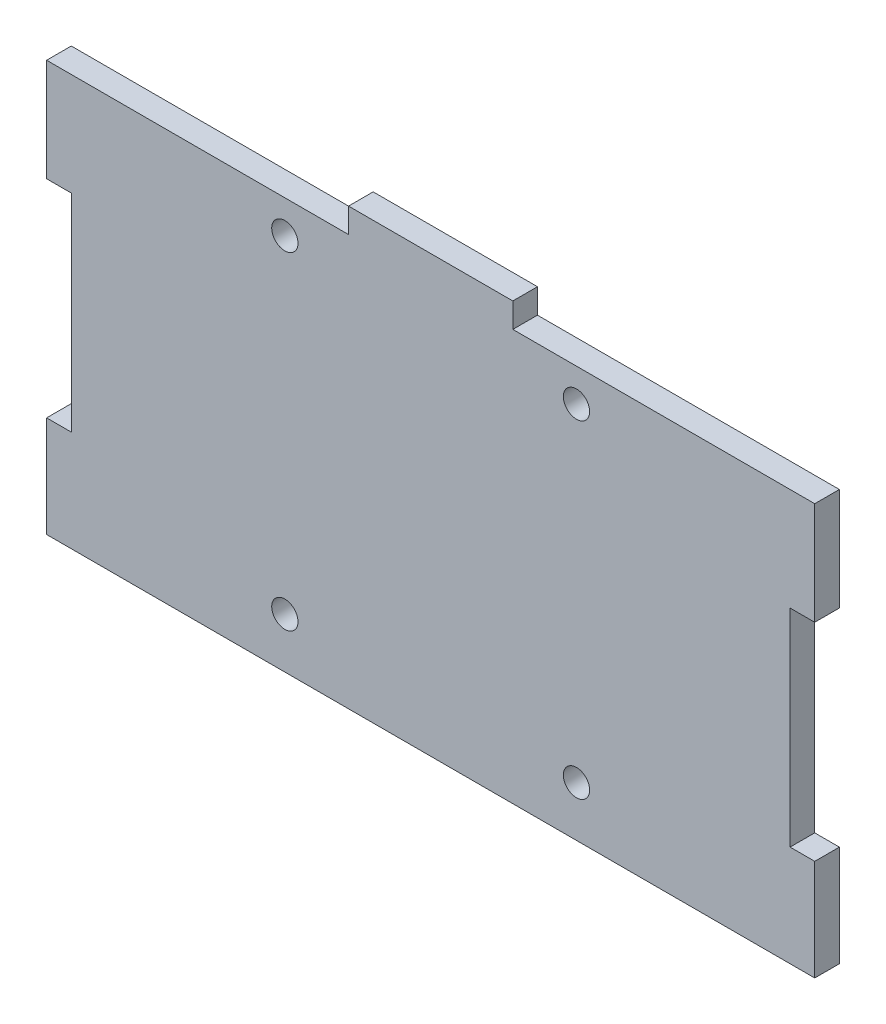
ISO-10303-21;
HEADER;
FILE_DESCRIPTION(('STEP AP214'),'2;1');
FILE_NAME('part.step','',(''),(''),'','','');
FILE_SCHEMA(('AUTOMOTIVE_DESIGN { 1 0 10303 214 1 1 1 1 }'));
ENDSEC;
DATA;
#1=APPLICATION_CONTEXT('core data for automotive mechanical design processes');
#2=APPLICATION_PROTOCOL_DEFINITION('international standard','automotive_design',2000,#1);
#3=PRODUCT_CONTEXT('',#1,'mechanical');
#4=PRODUCT('Part','Part','',(#3));
#5=PRODUCT_RELATED_PRODUCT_CATEGORY('part','',(#4));
#6=PRODUCT_DEFINITION_FORMATION('','',#4);
#7=PRODUCT_DEFINITION_CONTEXT('part definition',#1,'design');
#8=PRODUCT_DEFINITION('design','',#6,#7);
#9=PRODUCT_DEFINITION_SHAPE('','',#8);
#10=(LENGTH_UNIT() NAMED_UNIT(*) SI_UNIT(.MILLI.,.METRE.));
#11=(NAMED_UNIT(*) PLANE_ANGLE_UNIT() SI_UNIT($,.RADIAN.));
#12=(NAMED_UNIT(*) SI_UNIT($,.STERADIAN.) SOLID_ANGLE_UNIT());
#13=UNCERTAINTY_MEASURE_WITH_UNIT(LENGTH_MEASURE(1.E-05),#10,'distance_accuracy_value','');
#14=(GEOMETRIC_REPRESENTATION_CONTEXT(3) GLOBAL_UNCERTAINTY_ASSIGNED_CONTEXT((#13)) GLOBAL_UNIT_ASSIGNED_CONTEXT((#10,
#11,#12)) REPRESENTATION_CONTEXT('',''));
#15=CARTESIAN_POINT('',(0.,0.,0.));
#16=DIRECTION('',(0.,0.,1.));
#17=DIRECTION('',(1.,0.,0.));
#18=AXIS2_PLACEMENT_3D('',#15,#16,#17);
#19=CARTESIAN_POINT('',(-26.2,25.,3.));
#20=DIRECTION('',(0.,-1.,0.));
#21=DIRECTION('',(0.,0.,-1.));
#22=AXIS2_PLACEMENT_3D('',#19,#20,#21);
#23=PLANE('',#22);
#24=DIRECTION('',(0.,0.,1.));
#25=VECTOR('',#24,1.);
#26=CARTESIAN_POINT('',(-10.,25.,0.));
#27=LINE('',#26,#25);
#28=CARTESIAN_POINT('',(-10.,25.,0.));
#29=VERTEX_POINT('',#28);
#30=CARTESIAN_POINT('',(-10.,25.,3.));
#31=VERTEX_POINT('',#30);
#32=EDGE_CURVE('E294',#29,#31,#27,.T.);
#33=ORIENTED_EDGE('',*,*,#32,.F.);
#34=DIRECTION('',(-1.,0.,0.));
#35=VECTOR('',#34,1.);
#36=CARTESIAN_POINT('',(-26.2,25.,0.));
#37=LINE('',#36,#35);
#38=CARTESIAN_POINT('',(-46.75,25.,0.));
#39=VERTEX_POINT('',#38);
#40=EDGE_CURVE('E103',#29,#39,#37,.T.);
#41=ORIENTED_EDGE('',*,*,#40,.T.);
#42=DIRECTION('',(0.,0.,-1.));
#43=VECTOR('',#42,1.);
#44=CARTESIAN_POINT('',(-46.75,25.,3.));
#45=LINE('',#44,#43);
#46=CARTESIAN_POINT('',(-46.75,25.,3.));
#47=VERTEX_POINT('',#46);
#48=EDGE_CURVE('E171',#47,#39,#45,.T.);
#49=ORIENTED_EDGE('',*,*,#48,.F.);
#50=DIRECTION('',(-1.,0.,0.));
#51=VECTOR('',#50,1.);
#52=CARTESIAN_POINT('',(46.75,25.,3.));
#53=LINE('',#52,#51);
#54=EDGE_CURVE('E57',#31,#47,#53,.T.);
#55=ORIENTED_EDGE('',*,*,#54,.F.);
#56=EDGE_LOOP('',(#33,#41,#49,#55));
#57=FACE_BOUND('',#56,.T.);
#58=ADVANCED_FACE('F33',(#57),#23,.F.);
#59=CARTESIAN_POINT('',(-46.75,12.5,3.));
#60=DIRECTION('',(1.,0.,0.));
#61=DIRECTION('',(0.,0.,-1.));
#62=AXIS2_PLACEMENT_3D('',#59,#60,#61);
#63=PLANE('',#62);
#64=DIRECTION('',(0.,-1.,0.));
#65=VECTOR('',#64,1.);
#66=CARTESIAN_POINT('',(-46.75,12.5,0.));
#67=LINE('',#66,#65);
#68=CARTESIAN_POINT('',(-46.75,12.5,0.));
#69=VERTEX_POINT('',#68);
#70=EDGE_CURVE('E172',#39,#69,#67,.T.);
#71=ORIENTED_EDGE('',*,*,#70,.T.);
#72=DIRECTION('',(0.,0.,-1.));
#73=VECTOR('',#72,1.);
#74=CARTESIAN_POINT('',(-46.75,12.5,3.));
#75=LINE('',#74,#73);
#76=CARTESIAN_POINT('',(-46.75,12.5,3.));
#77=VERTEX_POINT('',#76);
#78=EDGE_CURVE('E11',#77,#69,#75,.T.);
#79=ORIENTED_EDGE('',*,*,#78,.F.);
#80=DIRECTION('',(0.,-1.,0.));
#81=VECTOR('',#80,1.);
#82=CARTESIAN_POINT('',(-46.75,12.5,3.));
#83=LINE('',#82,#81);
#84=EDGE_CURVE('E198',#47,#77,#83,.T.);
#85=ORIENTED_EDGE('',*,*,#84,.F.);
#86=ORIENTED_EDGE('',*,*,#48,.T.);
#87=EDGE_LOOP('',(#71,#79,#85,#86));
#88=FACE_BOUND('',#87,.T.);
#89=ADVANCED_FACE('F35',(#88),#63,.F.);
#90=CARTESIAN_POINT('',(-46.75,12.5,3.));
#91=DIRECTION('',(0.,1.,0.));
#92=DIRECTION('',(-1.,0.,0.));
#93=AXIS2_PLACEMENT_3D('',#90,#91,#92);
#94=PLANE('',#93);
#95=DIRECTION('',(1.,0.,0.));
#96=VECTOR('',#95,1.);
#97=CARTESIAN_POINT('',(-46.75,12.5,0.));
#98=LINE('',#97,#96);
#99=CARTESIAN_POINT('',(-43.75,12.5,0.));
#100=VERTEX_POINT('',#99);
#101=EDGE_CURVE('E175',#69,#100,#98,.T.);
#102=ORIENTED_EDGE('',*,*,#101,.T.);
#103=DIRECTION('',(0.,0.,-1.));
#104=VECTOR('',#103,1.);
#105=CARTESIAN_POINT('',(-43.75,12.5,3.));
#106=LINE('',#105,#104);
#107=CARTESIAN_POINT('',(-43.75,12.5,3.));
#108=VERTEX_POINT('',#107);
#109=EDGE_CURVE('E41',#108,#100,#106,.T.);
#110=ORIENTED_EDGE('',*,*,#109,.F.);
#111=DIRECTION('',(1.,0.,0.));
#112=VECTOR('',#111,1.);
#113=CARTESIAN_POINT('',(-46.75,12.5,3.));
#114=LINE('',#113,#112);
#115=EDGE_CURVE('E111',#77,#108,#114,.T.);
#116=ORIENTED_EDGE('',*,*,#115,.F.);
#117=ORIENTED_EDGE('',*,*,#78,.T.);
#118=EDGE_LOOP('',(#102,#110,#116,#117));
#119=FACE_BOUND('',#118,.T.);
#120=ADVANCED_FACE('F302',(#119),#94,.F.);
#121=CARTESIAN_POINT('',(-43.75,12.5,3.));
#122=DIRECTION('',(1.,0.,0.));
#123=DIRECTION('',(0.,0.,-1.));
#124=AXIS2_PLACEMENT_3D('',#121,#122,#123);
#125=PLANE('',#124);
#126=DIRECTION('',(0.,-1.,0.));
#127=VECTOR('',#126,1.);
#128=CARTESIAN_POINT('',(-43.75,12.5,0.));
#129=LINE('',#128,#127);
#130=CARTESIAN_POINT('',(-43.75,-12.7,0.));
#131=VERTEX_POINT('',#130);
#132=EDGE_CURVE('E178',#100,#131,#129,.T.);
#133=ORIENTED_EDGE('',*,*,#132,.T.);
#134=DIRECTION('',(0.,0.,-1.));
#135=VECTOR('',#134,1.);
#136=CARTESIAN_POINT('',(-43.75,-12.7,3.));
#137=LINE('',#136,#135);
#138=CARTESIAN_POINT('',(-43.75,-12.7,3.));
#139=VERTEX_POINT('',#138);
#140=EDGE_CURVE('E217',#139,#131,#137,.T.);
#141=ORIENTED_EDGE('',*,*,#140,.F.);
#142=DIRECTION('',(0.,-1.,0.));
#143=VECTOR('',#142,1.);
#144=CARTESIAN_POINT('',(-43.75,12.5,3.));
#145=LINE('',#144,#143);
#146=EDGE_CURVE('E225',#108,#139,#145,.T.);
#147=ORIENTED_EDGE('',*,*,#146,.F.);
#148=ORIENTED_EDGE('',*,*,#109,.T.);
#149=EDGE_LOOP('',(#133,#141,#147,#148));
#150=FACE_BOUND('',#149,.T.);
#151=ADVANCED_FACE('F223',(#150),#125,.F.);
#152=CARTESIAN_POINT('',(-46.75,-12.7,3.));
#153=DIRECTION('',(0.,-1.,0.));
#154=DIRECTION('',(1.,0.,0.));
#155=AXIS2_PLACEMENT_3D('',#152,#153,#154);
#156=PLANE('',#155);
#157=DIRECTION('',(-1.,0.,0.));
#158=VECTOR('',#157,1.);
#159=CARTESIAN_POINT('',(-46.75,-12.7,0.));
#160=LINE('',#159,#158);
#161=CARTESIAN_POINT('',(-46.75,-12.7,0.));
#162=VERTEX_POINT('',#161);
#163=EDGE_CURVE('E180',#131,#162,#160,.T.);
#164=ORIENTED_EDGE('',*,*,#163,.T.);
#165=DIRECTION('',(0.,0.,-1.));
#166=VECTOR('',#165,1.);
#167=CARTESIAN_POINT('',(-46.75,-12.7,3.));
#168=LINE('',#167,#166);
#169=CARTESIAN_POINT('',(-46.75,-12.7,3.));
#170=VERTEX_POINT('',#169);
#171=EDGE_CURVE('E214',#170,#162,#168,.T.);
#172=ORIENTED_EDGE('',*,*,#171,.F.);
#173=DIRECTION('',(-1.,0.,0.));
#174=VECTOR('',#173,1.);
#175=CARTESIAN_POINT('',(-46.75,-12.7,3.));
#176=LINE('',#175,#174);
#177=EDGE_CURVE('E243',#139,#170,#176,.T.);
#178=ORIENTED_EDGE('',*,*,#177,.F.);
#179=ORIENTED_EDGE('',*,*,#140,.T.);
#180=EDGE_LOOP('',(#164,#172,#178,#179));
#181=FACE_BOUND('',#180,.T.);
#182=ADVANCED_FACE('F234',(#181),#156,.F.);
#183=CARTESIAN_POINT('',(-46.75,-25.,3.));
#184=DIRECTION('',(1.,0.,0.));
#185=DIRECTION('',(0.,1.,0.));
#186=AXIS2_PLACEMENT_3D('',#183,#184,#185);
#187=PLANE('',#186);
#188=DIRECTION('',(0.,-1.,0.));
#189=VECTOR('',#188,1.);
#190=CARTESIAN_POINT('',(-46.75,-25.,0.));
#191=LINE('',#190,#189);
#192=CARTESIAN_POINT('',(-46.75,-25.,0.));
#193=VERTEX_POINT('',#192);
#194=EDGE_CURVE('E182',#162,#193,#191,.T.);
#195=ORIENTED_EDGE('',*,*,#194,.T.);
#196=DIRECTION('',(0.,0.,-1.));
#197=VECTOR('',#196,1.);
#198=CARTESIAN_POINT('',(-46.75,-25.,3.));
#199=LINE('',#198,#197);
#200=CARTESIAN_POINT('',(-46.75,-25.,3.));
#201=VERTEX_POINT('',#200);
#202=EDGE_CURVE('E211',#201,#193,#199,.T.);
#203=ORIENTED_EDGE('',*,*,#202,.F.);
#204=DIRECTION('',(0.,-1.,0.));
#205=VECTOR('',#204,1.);
#206=CARTESIAN_POINT('',(-46.75,-25.,3.));
#207=LINE('',#206,#205);
#208=EDGE_CURVE('E240',#170,#201,#207,.T.);
#209=ORIENTED_EDGE('',*,*,#208,.F.);
#210=ORIENTED_EDGE('',*,*,#171,.T.);
#211=EDGE_LOOP('',(#195,#203,#209,#210));
#212=FACE_BOUND('',#211,.T.);
#213=ADVANCED_FACE('F238',(#212),#187,.F.);
#214=CARTESIAN_POINT('',(46.75,-25.,3.));
#215=DIRECTION('',(0.,1.,0.));
#216=DIRECTION('',(-1.,0.,0.));
#217=AXIS2_PLACEMENT_3D('',#214,#215,#216);
#218=PLANE('',#217);
#219=DIRECTION('',(1.,0.,0.));
#220=VECTOR('',#219,1.);
#221=CARTESIAN_POINT('',(46.75,-25.,0.));
#222=LINE('',#221,#220);
#223=CARTESIAN_POINT('',(46.75,-25.,0.));
#224=VERTEX_POINT('',#223);
#225=EDGE_CURVE('E184',#193,#224,#222,.T.);
#226=ORIENTED_EDGE('',*,*,#225,.T.);
#227=DIRECTION('',(0.,0.,-1.));
#228=VECTOR('',#227,1.);
#229=CARTESIAN_POINT('',(46.75,-25.,3.));
#230=LINE('',#229,#228);
#231=CARTESIAN_POINT('',(46.75,-25.,3.));
#232=VERTEX_POINT('',#231);
#233=EDGE_CURVE('E208',#232,#224,#230,.T.);
#234=ORIENTED_EDGE('',*,*,#233,.F.);
#235=DIRECTION('',(1.,0.,0.));
#236=VECTOR('',#235,1.);
#237=CARTESIAN_POINT('',(46.75,-25.,3.));
#238=LINE('',#237,#236);
#239=EDGE_CURVE('E242',#201,#232,#238,.T.);
#240=ORIENTED_EDGE('',*,*,#239,.F.);
#241=ORIENTED_EDGE('',*,*,#202,.T.);
#242=EDGE_LOOP('',(#226,#234,#240,#241));
#243=FACE_BOUND('',#242,.T.);
#244=ADVANCED_FACE('F334',(#243),#218,.F.);
#245=CARTESIAN_POINT('',(46.75,-25.,3.));
#246=DIRECTION('',(-1.,0.,0.));
#247=DIRECTION('',(0.,-1.,0.));
#248=AXIS2_PLACEMENT_3D('',#245,#246,#247);
#249=PLANE('',#248);
#250=DIRECTION('',(0.,1.,0.));
#251=VECTOR('',#250,1.);
#252=CARTESIAN_POINT('',(46.75,-25.,0.));
#253=LINE('',#252,#251);
#254=CARTESIAN_POINT('',(46.75,-12.7,0.));
#255=VERTEX_POINT('',#254);
#256=EDGE_CURVE('E186',#224,#255,#253,.T.);
#257=ORIENTED_EDGE('',*,*,#256,.T.);
#258=DIRECTION('',(0.,0.,-1.));
#259=VECTOR('',#258,1.);
#260=CARTESIAN_POINT('',(46.75,-12.7,3.));
#261=LINE('',#260,#259);
#262=CARTESIAN_POINT('',(46.75,-12.7,3.));
#263=VERTEX_POINT('',#262);
#264=EDGE_CURVE('E205',#263,#255,#261,.T.);
#265=ORIENTED_EDGE('',*,*,#264,.F.);
#266=DIRECTION('',(0.,1.,0.));
#267=VECTOR('',#266,1.);
#268=CARTESIAN_POINT('',(46.75,-25.,3.));
#269=LINE('',#268,#267);
#270=EDGE_CURVE('E245',#232,#263,#269,.T.);
#271=ORIENTED_EDGE('',*,*,#270,.F.);
#272=ORIENTED_EDGE('',*,*,#233,.T.);
#273=EDGE_LOOP('',(#257,#265,#271,#272));
#274=FACE_BOUND('',#273,.T.);
#275=ADVANCED_FACE('F331',(#274),#249,.F.);
#276=CARTESIAN_POINT('',(46.75,-12.7,3.));
#277=DIRECTION('',(0.,-1.,0.));
#278=DIRECTION('',(0.,0.,-1.));
#279=AXIS2_PLACEMENT_3D('',#276,#277,#278);
#280=PLANE('',#279);
#281=DIRECTION('',(-1.,0.,0.));
#282=VECTOR('',#281,1.);
#283=CARTESIAN_POINT('',(46.75,-12.7,0.));
#284=LINE('',#283,#282);
#285=CARTESIAN_POINT('',(43.75,-12.7,0.));
#286=VERTEX_POINT('',#285);
#287=EDGE_CURVE('E188',#255,#286,#284,.T.);
#288=ORIENTED_EDGE('',*,*,#287,.T.);
#289=DIRECTION('',(0.,0.,-1.));
#290=VECTOR('',#289,1.);
#291=CARTESIAN_POINT('',(43.75,-12.7,3.));
#292=LINE('',#291,#290);
#293=CARTESIAN_POINT('',(43.75,-12.7,3.));
#294=VERTEX_POINT('',#293);
#295=EDGE_CURVE('E202',#294,#286,#292,.T.);
#296=ORIENTED_EDGE('',*,*,#295,.F.);
#297=DIRECTION('',(-1.,0.,0.));
#298=VECTOR('',#297,1.);
#299=CARTESIAN_POINT('',(46.75,-12.7,3.));
#300=LINE('',#299,#298);
#301=EDGE_CURVE('E251',#263,#294,#300,.T.);
#302=ORIENTED_EDGE('',*,*,#301,.F.);
#303=ORIENTED_EDGE('',*,*,#264,.T.);
#304=EDGE_LOOP('',(#288,#296,#302,#303));
#305=FACE_BOUND('',#304,.T.);
#306=ADVANCED_FACE('F257',(#305),#280,.F.);
#307=CARTESIAN_POINT('',(43.75,12.5,3.));
#308=DIRECTION('',(-1.,0.,0.));
#309=DIRECTION('',(0.,0.,1.));
#310=AXIS2_PLACEMENT_3D('',#307,#308,#309);
#311=PLANE('',#310);
#312=DIRECTION('',(0.,1.,0.));
#313=VECTOR('',#312,1.);
#314=CARTESIAN_POINT('',(43.75,12.5,0.));
#315=LINE('',#314,#313);
#316=CARTESIAN_POINT('',(43.75,12.5,0.));
#317=VERTEX_POINT('',#316);
#318=EDGE_CURVE('E190',#286,#317,#315,.T.);
#319=ORIENTED_EDGE('',*,*,#318,.T.);
#320=DIRECTION('',(0.,0.,-1.));
#321=VECTOR('',#320,1.);
#322=CARTESIAN_POINT('',(43.75,12.5,3.));
#323=LINE('',#322,#321);
#324=CARTESIAN_POINT('',(43.75,12.5,3.));
#325=VERTEX_POINT('',#324);
#326=EDGE_CURVE('E160',#325,#317,#323,.T.);
#327=ORIENTED_EDGE('',*,*,#326,.F.);
#328=DIRECTION('',(0.,1.,0.));
#329=VECTOR('',#328,1.);
#330=CARTESIAN_POINT('',(43.75,12.5,3.));
#331=LINE('',#330,#329);
#332=EDGE_CURVE('E147',#294,#325,#331,.T.);
#333=ORIENTED_EDGE('',*,*,#332,.F.);
#334=ORIENTED_EDGE('',*,*,#295,.T.);
#335=EDGE_LOOP('',(#319,#327,#333,#334));
#336=FACE_BOUND('',#335,.T.);
#337=ADVANCED_FACE('F261',(#336),#311,.F.);
#338=CARTESIAN_POINT('',(46.75,12.5,3.));
#339=DIRECTION('',(0.,1.,0.));
#340=DIRECTION('',(0.,0.,1.));
#341=AXIS2_PLACEMENT_3D('',#338,#339,#340);
#342=PLANE('',#341);
#343=DIRECTION('',(1.,0.,0.));
#344=VECTOR('',#343,1.);
#345=CARTESIAN_POINT('',(46.75,12.5,0.));
#346=LINE('',#345,#344);
#347=CARTESIAN_POINT('',(46.75,12.5,0.));
#348=VERTEX_POINT('',#347);
#349=EDGE_CURVE('E156',#317,#348,#346,.T.);
#350=ORIENTED_EDGE('',*,*,#349,.T.);
#351=DIRECTION('',(0.,0.,-1.));
#352=VECTOR('',#351,1.);
#353=CARTESIAN_POINT('',(46.75,12.5,3.));
#354=LINE('',#353,#352);
#355=CARTESIAN_POINT('',(46.75,12.5,3.));
#356=VERTEX_POINT('',#355);
#357=EDGE_CURVE('E153',#356,#348,#354,.T.);
#358=ORIENTED_EDGE('',*,*,#357,.F.);
#359=DIRECTION('',(1.,0.,0.));
#360=VECTOR('',#359,1.);
#361=CARTESIAN_POINT('',(46.75,12.5,3.));
#362=LINE('',#361,#360);
#363=EDGE_CURVE('E139',#325,#356,#362,.T.);
#364=ORIENTED_EDGE('',*,*,#363,.F.);
#365=ORIENTED_EDGE('',*,*,#326,.T.);
#366=EDGE_LOOP('',(#350,#358,#364,#365));
#367=FACE_BOUND('',#366,.T.);
#368=ADVANCED_FACE('F154',(#367),#342,.F.);
#369=CARTESIAN_POINT('',(46.75,12.5,3.));
#370=DIRECTION('',(-1.,0.,0.));
#371=DIRECTION('',(0.,-1.,0.));
#372=AXIS2_PLACEMENT_3D('',#369,#370,#371);
#373=PLANE('',#372);
#374=DIRECTION('',(0.,1.,0.));
#375=VECTOR('',#374,1.);
#376=CARTESIAN_POINT('',(46.75,12.5,0.));
#377=LINE('',#376,#375);
#378=CARTESIAN_POINT('',(46.75,25.,0.));
#379=VERTEX_POINT('',#378);
#380=EDGE_CURVE('E193',#348,#379,#377,.T.);
#381=ORIENTED_EDGE('',*,*,#380,.T.);
#382=DIRECTION('',(0.,0.,-1.));
#383=VECTOR('',#382,1.);
#384=CARTESIAN_POINT('',(46.75,25.,3.));
#385=LINE('',#384,#383);
#386=CARTESIAN_POINT('',(46.75,25.,3.));
#387=VERTEX_POINT('',#386);
#388=EDGE_CURVE('E161',#387,#379,#385,.T.);
#389=ORIENTED_EDGE('',*,*,#388,.F.);
#390=DIRECTION('',(0.,1.,0.));
#391=VECTOR('',#390,1.);
#392=CARTESIAN_POINT('',(46.75,12.5,3.));
#393=LINE('',#392,#391);
#394=EDGE_CURVE('E144',#356,#387,#393,.T.);
#395=ORIENTED_EDGE('',*,*,#394,.F.);
#396=ORIENTED_EDGE('',*,*,#357,.T.);
#397=EDGE_LOOP('',(#381,#389,#395,#396));
#398=FACE_BOUND('',#397,.T.);
#399=ADVANCED_FACE('F163',(#398),#373,.F.);
#400=CARTESIAN_POINT('',(10.,25.,0.));
#401=VERTEX_POINT('',#400);
#402=EDGE_CURVE('E195',#379,#401,#37,.T.);
#403=ORIENTED_EDGE('',*,*,#402,.T.);
#404=DIRECTION('',(0.,0.,1.));
#405=VECTOR('',#404,1.);
#406=CARTESIAN_POINT('',(10.,25.,0.));
#407=LINE('',#406,#405);
#408=CARTESIAN_POINT('',(10.,25.,3.));
#409=VERTEX_POINT('',#408);
#410=EDGE_CURVE('E266',#401,#409,#407,.T.);
#411=ORIENTED_EDGE('',*,*,#410,.T.);
#412=EDGE_CURVE('E167',#387,#409,#53,.T.);
#413=ORIENTED_EDGE('',*,*,#412,.F.);
#414=ORIENTED_EDGE('',*,*,#388,.T.);
#415=EDGE_LOOP('',(#403,#411,#413,#414));
#416=FACE_BOUND('',#415,.T.);
#417=ADVANCED_FACE('F264',(#416),#23,.F.);
#418=CARTESIAN_POINT('',(0.,0.,3.));
#419=DIRECTION('',(0.,0.,1.));
#420=DIRECTION('',(1.,0.,0.));
#421=AXIS2_PLACEMENT_3D('',#418,#419,#420);
#422=PLANE('',#421);
#423=CARTESIAN_POINT('',(17.7499999999998,-18.9,3.));
#424=DIRECTION('',(0.,0.,1.));
#425=DIRECTION('',(1.,0.,0.));
#426=AXIS2_PLACEMENT_3D('',#423,#424,#425);
#427=CIRCLE('',#426,1.59999999999916);
#428=CARTESIAN_POINT('',(19.3499999999989,-18.9,3.));
#429=VERTEX_POINT('',#428);
#430=EDGE_CURVE('E478',#429,#429,#427,.T.);
#431=ORIENTED_EDGE('',*,*,#430,.F.);
#432=EDGE_LOOP('',(#431));
#433=FACE_BOUND('',#432,.T.);
#434=CARTESIAN_POINT('',(-17.7499999999954,-18.8999999999981,3.));
#435=DIRECTION('',(0.,0.,1.));
#436=DIRECTION('',(1.,0.,0.));
#437=AXIS2_PLACEMENT_3D('',#434,#435,#436);
#438=CIRCLE('',#437,1.59999999999881);
#439=CARTESIAN_POINT('',(-16.1499999999966,-18.8999999999981,3.));
#440=VERTEX_POINT('',#439);
#441=EDGE_CURVE('E484',#440,#440,#438,.T.);
#442=ORIENTED_EDGE('',*,*,#441,.F.);
#443=EDGE_LOOP('',(#442));
#444=FACE_BOUND('',#443,.T.);
#445=CARTESIAN_POINT('',(17.7500000000002,21.,3.));
#446=DIRECTION('',(0.,0.,-1.));
#447=DIRECTION('',(-1.,0.,0.));
#448=AXIS2_PLACEMENT_3D('',#445,#446,#447);
#449=CIRCLE('',#448,1.59999999999999);
#450=CARTESIAN_POINT('',(16.1500000000002,21.,3.));
#451=VERTEX_POINT('',#450);
#452=EDGE_CURVE('E489',#451,#451,#449,.T.);
#453=ORIENTED_EDGE('',*,*,#452,.T.);
#454=EDGE_LOOP('',(#453));
#455=FACE_BOUND('',#454,.T.);
#456=CARTESIAN_POINT('',(-17.7499999999998,21.0000000000011,3.));
#457=DIRECTION('',(0.,0.,1.));
#458=DIRECTION('',(1.,0.,0.));
#459=AXIS2_PLACEMENT_3D('',#456,#457,#458);
#460=CIRCLE('',#459,1.6);
#461=CARTESIAN_POINT('',(-16.1499999999998,21.0000000000011,3.));
#462=VERTEX_POINT('',#461);
#463=EDGE_CURVE('E492',#462,#462,#460,.T.);
#464=ORIENTED_EDGE('',*,*,#463,.F.);
#465=EDGE_LOOP('',(#464));
#466=FACE_BOUND('',#465,.T.);
#467=ORIENTED_EDGE('',*,*,#84,.T.);
#468=ORIENTED_EDGE('',*,*,#115,.T.);
#469=ORIENTED_EDGE('',*,*,#146,.T.);
#470=ORIENTED_EDGE('',*,*,#177,.T.);
#471=ORIENTED_EDGE('',*,*,#208,.T.);
#472=ORIENTED_EDGE('',*,*,#239,.T.);
#473=ORIENTED_EDGE('',*,*,#270,.T.);
#474=ORIENTED_EDGE('',*,*,#301,.T.);
#475=ORIENTED_EDGE('',*,*,#332,.T.);
#476=ORIENTED_EDGE('',*,*,#363,.T.);
#477=ORIENTED_EDGE('',*,*,#394,.T.);
#478=ORIENTED_EDGE('',*,*,#412,.T.);
#479=DIRECTION('',(0.,1.,0.));
#480=VECTOR('',#479,1.);
#481=CARTESIAN_POINT('',(10.,25.,3.));
#482=LINE('',#481,#480);
#483=CARTESIAN_POINT('',(10.,28.,3.));
#484=VERTEX_POINT('',#483);
#485=EDGE_CURVE('E48',#409,#484,#482,.T.);
#486=ORIENTED_EDGE('',*,*,#485,.T.);
#487=DIRECTION('',(-1.,0.,0.));
#488=VECTOR('',#487,1.);
#489=CARTESIAN_POINT('',(-10.,28.,3.));
#490=LINE('',#489,#488);
#491=CARTESIAN_POINT('',(-10.,28.,3.));
#492=VERTEX_POINT('',#491);
#493=EDGE_CURVE('E270',#484,#492,#490,.T.);
#494=ORIENTED_EDGE('',*,*,#493,.T.);
#495=DIRECTION('',(0.,-1.,0.));
#496=VECTOR('',#495,1.);
#497=CARTESIAN_POINT('',(-10.,25.,3.));
#498=LINE('',#497,#496);
#499=EDGE_CURVE('E272',#492,#31,#498,.T.);
#500=ORIENTED_EDGE('',*,*,#499,.T.);
#501=ORIENTED_EDGE('',*,*,#54,.T.);
#502=EDGE_LOOP('',(#467,#468,#469,#470,#471,#472,#473,#474,#475,#476,#477,#478,#486,#494,#500,#501));
#503=FACE_BOUND('',#502,.T.);
#504=ADVANCED_FACE('F141',(#433,#444,#455,#466,#503),#422,.T.);
#505=CARTESIAN_POINT('',(0.,0.,0.));
#506=DIRECTION('',(0.,0.,1.));
#507=DIRECTION('',(1.,0.,0.));
#508=AXIS2_PLACEMENT_3D('',#505,#506,#507);
#509=PLANE('',#508);
#510=CARTESIAN_POINT('',(17.7499999999998,-18.9,0.));
#511=DIRECTION('',(0.,0.,1.));
#512=DIRECTION('',(1.,0.,0.));
#513=AXIS2_PLACEMENT_3D('',#510,#511,#512);
#514=CIRCLE('',#513,1.59999999999916);
#515=CARTESIAN_POINT('',(19.3499999999989,-18.9,0.));
#516=VERTEX_POINT('',#515);
#517=EDGE_CURVE('E475',#516,#516,#514,.T.);
#518=ORIENTED_EDGE('',*,*,#517,.T.);
#519=EDGE_LOOP('',(#518));
#520=FACE_BOUND('',#519,.T.);
#521=CARTESIAN_POINT('',(-17.7499999999954,-18.8999999999981,0.));
#522=DIRECTION('',(0.,0.,1.));
#523=DIRECTION('',(1.,0.,0.));
#524=AXIS2_PLACEMENT_3D('',#521,#522,#523);
#525=CIRCLE('',#524,1.59999999999881);
#526=CARTESIAN_POINT('',(-16.1499999999966,-18.8999999999981,0.));
#527=VERTEX_POINT('',#526);
#528=EDGE_CURVE('E479',#527,#527,#525,.T.);
#529=ORIENTED_EDGE('',*,*,#528,.T.);
#530=EDGE_LOOP('',(#529));
#531=FACE_BOUND('',#530,.T.);
#532=CARTESIAN_POINT('',(17.7500000000002,21.,0.));
#533=DIRECTION('',(0.,0.,-1.));
#534=DIRECTION('',(-1.,0.,0.));
#535=AXIS2_PLACEMENT_3D('',#532,#533,#534);
#536=CIRCLE('',#535,1.59999999999999);
#537=CARTESIAN_POINT('',(16.1500000000002,21.,0.));
#538=VERTEX_POINT('',#537);
#539=EDGE_CURVE('E481',#538,#538,#536,.T.);
#540=ORIENTED_EDGE('',*,*,#539,.F.);
#541=EDGE_LOOP('',(#540));
#542=FACE_BOUND('',#541,.T.);
#543=CARTESIAN_POINT('',(-17.7499999999998,21.0000000000011,0.));
#544=DIRECTION('',(0.,0.,1.));
#545=DIRECTION('',(1.,0.,0.));
#546=AXIS2_PLACEMENT_3D('',#543,#544,#545);
#547=CIRCLE('',#546,1.6);
#548=CARTESIAN_POINT('',(-16.1499999999998,21.0000000000011,0.));
#549=VERTEX_POINT('',#548);
#550=EDGE_CURVE('E495',#549,#549,#547,.T.);
#551=ORIENTED_EDGE('',*,*,#550,.T.);
#552=EDGE_LOOP('',(#551));
#553=FACE_BOUND('',#552,.T.);
#554=ORIENTED_EDGE('',*,*,#70,.F.);
#555=ORIENTED_EDGE('',*,*,#40,.F.);
#556=DIRECTION('',(0.,-1.,0.));
#557=VECTOR('',#556,1.);
#558=CARTESIAN_POINT('',(-10.,25.,0.));
#559=LINE('',#558,#557);
#560=CARTESIAN_POINT('',(-10.,28.,0.));
#561=VERTEX_POINT('',#560);
#562=EDGE_CURVE('E284',#561,#29,#559,.T.);
#563=ORIENTED_EDGE('',*,*,#562,.F.);
#564=DIRECTION('',(-1.,0.,0.));
#565=VECTOR('',#564,1.);
#566=CARTESIAN_POINT('',(-10.,28.,0.));
#567=LINE('',#566,#565);
#568=CARTESIAN_POINT('',(10.,28.,0.));
#569=VERTEX_POINT('',#568);
#570=EDGE_CURVE('E297',#569,#561,#567,.T.);
#571=ORIENTED_EDGE('',*,*,#570,.F.);
#572=DIRECTION('',(0.,1.,0.));
#573=VECTOR('',#572,1.);
#574=CARTESIAN_POINT('',(10.,25.,0.));
#575=LINE('',#574,#573);
#576=EDGE_CURVE('E287',#401,#569,#575,.T.);
#577=ORIENTED_EDGE('',*,*,#576,.F.);
#578=ORIENTED_EDGE('',*,*,#402,.F.);
#579=ORIENTED_EDGE('',*,*,#380,.F.);
#580=ORIENTED_EDGE('',*,*,#349,.F.);
#581=ORIENTED_EDGE('',*,*,#318,.F.);
#582=ORIENTED_EDGE('',*,*,#287,.F.);
#583=ORIENTED_EDGE('',*,*,#256,.F.);
#584=ORIENTED_EDGE('',*,*,#225,.F.);
#585=ORIENTED_EDGE('',*,*,#194,.F.);
#586=ORIENTED_EDGE('',*,*,#163,.F.);
#587=ORIENTED_EDGE('',*,*,#132,.F.);
#588=ORIENTED_EDGE('',*,*,#101,.F.);
#589=EDGE_LOOP('',(#554,#555,#563,#571,#577,#578,#579,#580,#581,#582,#583,#584,#585,#586,#587,#588));
#590=FACE_BOUND('',#589,.T.);
#591=ADVANCED_FACE('F229',(#520,#531,#542,#553,#590),#509,.F.);
#592=CARTESIAN_POINT('',(-10.,25.,0.));
#593=DIRECTION('',(-1.,0.,0.));
#594=DIRECTION('',(0.,0.,1.));
#595=AXIS2_PLACEMENT_3D('',#592,#593,#594);
#596=PLANE('',#595);
#597=ORIENTED_EDGE('',*,*,#499,.F.);
#598=DIRECTION('',(0.,0.,1.));
#599=VECTOR('',#598,1.);
#600=CARTESIAN_POINT('',(-10.,28.,0.));
#601=LINE('',#600,#599);
#602=EDGE_CURVE('E176',#561,#492,#601,.T.);
#603=ORIENTED_EDGE('',*,*,#602,.F.);
#604=ORIENTED_EDGE('',*,*,#562,.T.);
#605=ORIENTED_EDGE('',*,*,#32,.T.);
#606=EDGE_LOOP('',(#597,#603,#604,#605));
#607=FACE_BOUND('',#606,.T.);
#608=ADVANCED_FACE('F392',(#607),#596,.T.);
#609=CARTESIAN_POINT('',(-10.,28.,0.));
#610=DIRECTION('',(0.,1.,0.));
#611=DIRECTION('',(0.,0.,1.));
#612=AXIS2_PLACEMENT_3D('',#609,#610,#611);
#613=PLANE('',#612);
#614=ORIENTED_EDGE('',*,*,#493,.F.);
#615=DIRECTION('',(0.,0.,1.));
#616=VECTOR('',#615,1.);
#617=CARTESIAN_POINT('',(10.,28.,0.));
#618=LINE('',#617,#616);
#619=EDGE_CURVE('E280',#569,#484,#618,.T.);
#620=ORIENTED_EDGE('',*,*,#619,.F.);
#621=ORIENTED_EDGE('',*,*,#570,.T.);
#622=ORIENTED_EDGE('',*,*,#602,.T.);
#623=EDGE_LOOP('',(#614,#620,#621,#622));
#624=FACE_BOUND('',#623,.T.);
#625=ADVANCED_FACE('F277',(#624),#613,.T.);
#626=CARTESIAN_POINT('',(10.,25.,0.));
#627=DIRECTION('',(1.,0.,0.));
#628=DIRECTION('',(0.,1.,0.));
#629=AXIS2_PLACEMENT_3D('',#626,#627,#628);
#630=PLANE('',#629);
#631=ORIENTED_EDGE('',*,*,#485,.F.);
#632=ORIENTED_EDGE('',*,*,#410,.F.);
#633=ORIENTED_EDGE('',*,*,#576,.T.);
#634=ORIENTED_EDGE('',*,*,#619,.T.);
#635=EDGE_LOOP('',(#631,#632,#633,#634));
#636=FACE_BOUND('',#635,.T.);
#637=ADVANCED_FACE('F408',(#636),#630,.T.);
#638=CARTESIAN_POINT('',(-17.7499999999998,21.0000000000011,0.));
#639=DIRECTION('',(0.,0.,1.));
#640=DIRECTION('',(1.,0.,0.));
#641=AXIS2_PLACEMENT_3D('',#638,#639,#640);
#642=CYLINDRICAL_SURFACE('',#641,1.6);
#643=ORIENTED_EDGE('',*,*,#550,.F.);
#644=EDGE_LOOP('',(#643));
#645=FACE_BOUND('',#644,.T.);
#646=ORIENTED_EDGE('',*,*,#463,.T.);
#647=EDGE_LOOP('',(#646));
#648=FACE_BOUND('',#647,.T.);
#649=ADVANCED_FACE('F417',(#645,#648),#642,.F.);
#650=CARTESIAN_POINT('',(17.7500000000002,21.,3.));
#651=DIRECTION('',(0.,0.,-1.));
#652=DIRECTION('',(-1.,0.,0.));
#653=AXIS2_PLACEMENT_3D('',#650,#651,#652);
#654=CYLINDRICAL_SURFACE('',#653,1.59999999999999);
#655=ORIENTED_EDGE('',*,*,#452,.F.);
#656=EDGE_LOOP('',(#655));
#657=FACE_BOUND('',#656,.T.);
#658=ORIENTED_EDGE('',*,*,#539,.T.);
#659=EDGE_LOOP('',(#658));
#660=FACE_BOUND('',#659,.T.);
#661=ADVANCED_FACE('F426',(#657,#660),#654,.F.);
#662=CARTESIAN_POINT('',(-17.7499999999954,-18.8999999999981,0.));
#663=DIRECTION('',(0.,0.,1.));
#664=DIRECTION('',(1.,0.,0.));
#665=AXIS2_PLACEMENT_3D('',#662,#663,#664);
#666=CYLINDRICAL_SURFACE('',#665,1.59999999999881);
#667=ORIENTED_EDGE('',*,*,#528,.F.);
#668=EDGE_LOOP('',(#667));
#669=FACE_BOUND('',#668,.T.);
#670=ORIENTED_EDGE('',*,*,#441,.T.);
#671=EDGE_LOOP('',(#670));
#672=FACE_BOUND('',#671,.T.);
#673=ADVANCED_FACE('F436',(#669,#672),#666,.F.);
#674=CARTESIAN_POINT('',(17.7499999999998,-18.9,0.));
#675=DIRECTION('',(0.,0.,1.));
#676=DIRECTION('',(1.,0.,0.));
#677=AXIS2_PLACEMENT_3D('',#674,#675,#676);
#678=CYLINDRICAL_SURFACE('',#677,1.59999999999916);
#679=ORIENTED_EDGE('',*,*,#517,.F.);
#680=EDGE_LOOP('',(#679));
#681=FACE_BOUND('',#680,.T.);
#682=ORIENTED_EDGE('',*,*,#430,.T.);
#683=EDGE_LOOP('',(#682));
#684=FACE_BOUND('',#683,.T.);
#685=ADVANCED_FACE('F458',(#681,#684),#678,.F.);
#686=CLOSED_SHELL('',(#58,#89,#120,#151,#182,#213,#244,#275,#306,#337,#368,#399,#417,#504,#591,
#608,#625,#637,#649,#661,#673,#685));
#687=MANIFOLD_SOLID_BREP('B2',#686);
#688=ADVANCED_BREP_SHAPE_REPRESENTATION('',(#18,#687),#14);
#689=SHAPE_DEFINITION_REPRESENTATION(#9,#688);
ENDSEC;
END-ISO-10303-21;
